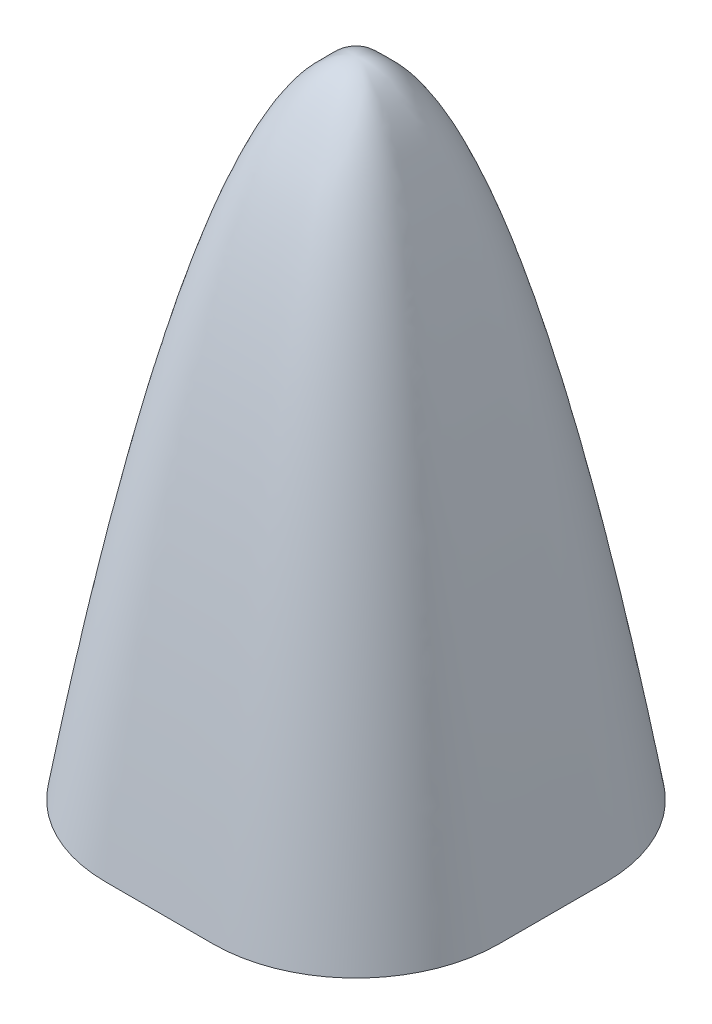
ISO-10303-21;
HEADER;
FILE_DESCRIPTION(('STEP AP214'),'2;1');
FILE_NAME('part.step','',(''),(''),'','','');
FILE_SCHEMA(('AUTOMOTIVE_DESIGN { 1 0 10303 214 1 1 1 1 }'));
ENDSEC;
DATA;
#1=APPLICATION_CONTEXT('core data for automotive mechanical design processes');
#2=APPLICATION_PROTOCOL_DEFINITION('international standard','automotive_design',2000,#1);
#3=PRODUCT_CONTEXT('',#1,'mechanical');
#4=PRODUCT('Part','Part','',(#3));
#5=PRODUCT_RELATED_PRODUCT_CATEGORY('part','',(#4));
#6=PRODUCT_DEFINITION_FORMATION('','',#4);
#7=PRODUCT_DEFINITION_CONTEXT('part definition',#1,'design');
#8=PRODUCT_DEFINITION('design','',#6,#7);
#9=PRODUCT_DEFINITION_SHAPE('','',#8);
#10=(LENGTH_UNIT() NAMED_UNIT(*) SI_UNIT(.MILLI.,.METRE.));
#11=(NAMED_UNIT(*) PLANE_ANGLE_UNIT() SI_UNIT($,.RADIAN.));
#12=(NAMED_UNIT(*) SI_UNIT($,.STERADIAN.) SOLID_ANGLE_UNIT());
#13=UNCERTAINTY_MEASURE_WITH_UNIT(LENGTH_MEASURE(1.E-05),#10,'distance_accuracy_value','');
#14=(GEOMETRIC_REPRESENTATION_CONTEXT(3) GLOBAL_UNCERTAINTY_ASSIGNED_CONTEXT((#13)) GLOBAL_UNIT_ASSIGNED_CONTEXT((#10,
#11,#12)) REPRESENTATION_CONTEXT('',''));
#15=CARTESIAN_POINT('',(0.,0.,0.));
#16=DIRECTION('',(0.,0.,1.));
#17=DIRECTION('',(1.,0.,0.));
#18=AXIS2_PLACEMENT_3D('',#15,#16,#17);
#19=CARTESIAN_POINT('',(1.5,0.,1.5));
#20=DIRECTION('',(0.,1.,0.));
#21=DIRECTION('',(0.,0.,1.));
#22=AXIS2_PLACEMENT_3D('',#19,#20,#21);
#23=PLANE('',#22);
#24=DIRECTION('',(1.,0.,0.));
#25=VECTOR('',#24,1.);
#26=CARTESIAN_POINT('',(-1.49999999999997,0.,5.5));
#27=LINE('',#26,#25);
#28=CARTESIAN_POINT('',(-1.5,0.,5.5));
#29=VERTEX_POINT('',#28);
#30=CARTESIAN_POINT('',(1.49999999999997,0.,5.5));
#31=VERTEX_POINT('',#30);
#32=EDGE_CURVE('E201',#29,#31,#27,.T.);
#33=ORIENTED_EDGE('',*,*,#32,.F.);
#34=CARTESIAN_POINT('',(-1.5,0.,1.5));
#35=DIRECTION('',(0.,1.,0.));
#36=DIRECTION('',(0.,0.,1.));
#37=AXIS2_PLACEMENT_3D('',#34,#35,#36);
#38=CIRCLE('',#37,4.);
#39=CARTESIAN_POINT('',(-5.5,0.,1.49999999999997));
#40=VERTEX_POINT('',#39);
#41=EDGE_CURVE('E13',#40,#29,#38,.T.);
#42=ORIENTED_EDGE('',*,*,#41,.F.);
#43=DIRECTION('',(0.,0.,1.));
#44=VECTOR('',#43,1.);
#45=CARTESIAN_POINT('',(-5.5,0.,-1.49999999999997));
#46=LINE('',#45,#44);
#47=CARTESIAN_POINT('',(-5.5,0.,-1.49999999999997));
#48=VERTEX_POINT('',#47);
#49=EDGE_CURVE('E166',#48,#40,#46,.T.);
#50=ORIENTED_EDGE('',*,*,#49,.F.);
#51=CARTESIAN_POINT('',(-1.5,0.,-1.5));
#52=DIRECTION('',(0.,1.,0.));
#53=DIRECTION('',(0.,0.,1.));
#54=AXIS2_PLACEMENT_3D('',#51,#52,#53);
#55=CIRCLE('',#54,4.);
#56=CARTESIAN_POINT('',(-1.49999999999997,0.,-5.5));
#57=VERTEX_POINT('',#56);
#58=EDGE_CURVE('E266',#57,#48,#55,.T.);
#59=ORIENTED_EDGE('',*,*,#58,.F.);
#60=DIRECTION('',(1.,0.,0.));
#61=VECTOR('',#60,1.);
#62=CARTESIAN_POINT('',(-1.49999999999997,0.,-5.5));
#63=LINE('',#62,#61);
#64=CARTESIAN_POINT('',(1.49999999999997,0.,-5.5));
#65=VERTEX_POINT('',#64);
#66=EDGE_CURVE('E258',#57,#65,#63,.T.);
#67=ORIENTED_EDGE('',*,*,#66,.T.);
#68=CARTESIAN_POINT('',(1.5,0.,-1.5));
#69=DIRECTION('',(0.,1.,0.));
#70=DIRECTION('',(0.,0.,1.));
#71=AXIS2_PLACEMENT_3D('',#68,#69,#70);
#72=CIRCLE('',#71,4.);
#73=CARTESIAN_POINT('',(5.5,0.,-1.49999999999997));
#74=VERTEX_POINT('',#73);
#75=EDGE_CURVE('E242',#74,#65,#72,.T.);
#76=ORIENTED_EDGE('',*,*,#75,.F.);
#77=DIRECTION('',(0.,0.,1.));
#78=VECTOR('',#77,1.);
#79=CARTESIAN_POINT('',(5.5,0.,-1.49999999999997));
#80=LINE('',#79,#78);
#81=CARTESIAN_POINT('',(5.5,0.,1.49999999999997));
#82=VERTEX_POINT('',#81);
#83=EDGE_CURVE('E203',#74,#82,#80,.T.);
#84=ORIENTED_EDGE('',*,*,#83,.T.);
#85=CARTESIAN_POINT('',(1.5,0.,1.5));
#86=DIRECTION('',(0.,1.,0.));
#87=DIRECTION('',(0.,0.,1.));
#88=AXIS2_PLACEMENT_3D('',#85,#86,#87);
#89=CIRCLE('',#88,4.);
#90=EDGE_CURVE('E202',#31,#82,#89,.T.);
#91=ORIENTED_EDGE('',*,*,#90,.F.);
#92=EDGE_LOOP('',(#33,#42,#50,#59,#67,#76,#84,#91));
#93=FACE_BOUND('',#92,.T.);
#94=ADVANCED_FACE('F152',(#93),#23,.F.);
#95=CARTESIAN_POINT('',(0.,0.,-5.5));
#96=CARTESIAN_POINT('',(0.,12.,-3.66666666666667));
#97=CARTESIAN_POINT('',(0.,18.,-1.83333333333333));
#98=CARTESIAN_POINT('',(0.,18.,0.));
#99=CARTESIAN_POINT('',(-0.124999999999998,0.,-5.5));
#100=CARTESIAN_POINT('',(-0.0833333333333317,12.,-3.66666666666667));
#101=CARTESIAN_POINT('',(-0.0416666666666659,18.,-1.83333333333333));
#102=CARTESIAN_POINT('',(0.,18.,0.));
#103=CARTESIAN_POINT('',(-0.374999999999992,0.,-5.5));
#104=CARTESIAN_POINT('',(-0.249999999999995,12.,-3.66666666666666));
#105=CARTESIAN_POINT('',(-0.124999999999997,18.,-1.83333333333333));
#106=CARTESIAN_POINT('',(0.,18.,0.));
#107=CARTESIAN_POINT('',(-0.749999999999986,0.,-5.5));
#108=CARTESIAN_POINT('',(-0.49999999999999,12.,-3.66666666666667));
#109=CARTESIAN_POINT('',(-0.249999999999995,18.,-1.83333333333333));
#110=CARTESIAN_POINT('',(0.,18.,0.));
#111=CARTESIAN_POINT('',(-1.12499999999998,0.,-5.49999999999999));
#112=CARTESIAN_POINT('',(-0.749999999999984,12.,-3.66666666666666));
#113=CARTESIAN_POINT('',(-0.374999999999992,18.,-1.83333333333333));
#114=CARTESIAN_POINT('',(0.,18.,0.));
#115=CARTESIAN_POINT('',(-1.37499999999997,0.,-5.5));
#116=CARTESIAN_POINT('',(-0.916666666666648,12.,-3.66666666666667));
#117=CARTESIAN_POINT('',(-0.458333333333324,18.,-1.83333333333333));
#118=CARTESIAN_POINT('',(0.,18.,0.));
#119=CARTESIAN_POINT('',(-2.02359877219142,0.,-5.5));
#120=CARTESIAN_POINT('',(-1.34906584812761,12.,-3.66666666666667));
#121=CARTESIAN_POINT('',(-0.674532924063806,18.,-1.83333333333333));
#122=CARTESIAN_POINT('',(0.,18.,0.));
#123=CARTESIAN_POINT('',(-3.07062167964767,0.,-5.29196002703282));
#124=CARTESIAN_POINT('',(-2.04708111976512,12.,-3.52797335135521));
#125=CARTESIAN_POINT('',(-1.02354055988256,18.,-1.76398667567761));
#126=CARTESIAN_POINT('',(0.,18.,0.));
#127=CARTESIAN_POINT('',(-4.40212765733191,0.,-4.40212765733191));
#128=CARTESIAN_POINT('',(-2.93475177155461,12.,-2.93475177155461));
#129=CARTESIAN_POINT('',(-1.4673758857773,18.,-1.4673758857773));
#130=CARTESIAN_POINT('',(0.,18.,0.));
#131=CARTESIAN_POINT('',(-5.29196002703281,0.,-3.07062167964768));
#132=CARTESIAN_POINT('',(-3.52797335135521,12.,-2.04708111976512));
#133=CARTESIAN_POINT('',(-1.7639866756776,18.,-1.02354055988256));
#134=CARTESIAN_POINT('',(0.,18.,0.));
#135=CARTESIAN_POINT('',(-5.5,0.,-2.02359877219142));
#136=CARTESIAN_POINT('',(-3.66666666666667,12.,-1.34906584812761));
#137=CARTESIAN_POINT('',(-1.83333333333333,18.,-0.674532924063806));
#138=CARTESIAN_POINT('',(0.,18.,0.));
#139=CARTESIAN_POINT('',(-5.5,0.,-1.24999999999998));
#140=CARTESIAN_POINT('',(-3.66666666666667,12.,-0.833333333333318));
#141=CARTESIAN_POINT('',(-1.83333333333333,18.,-0.416666666666659));
#142=CARTESIAN_POINT('',(0.,18.,0.));
#143=CARTESIAN_POINT('',(-5.5,0.,-0.749999999999986));
#144=CARTESIAN_POINT('',(-3.66666666666667,12.,-0.499999999999991));
#145=CARTESIAN_POINT('',(-1.83333333333333,18.,-0.249999999999996));
#146=CARTESIAN_POINT('',(0.,18.,0.));
#147=CARTESIAN_POINT('',(-5.5,0.,0.));
#148=CARTESIAN_POINT('',(-3.66666666666667,12.,0.));
#149=CARTESIAN_POINT('',(-1.83333333333333,18.,0.));
#150=CARTESIAN_POINT('',(0.,18.,0.));
#151=CARTESIAN_POINT('',(-5.5,0.,0.749999999999984));
#152=CARTESIAN_POINT('',(-3.66666666666666,12.,0.499999999999989));
#153=CARTESIAN_POINT('',(-1.83333333333333,18.,0.249999999999994));
#154=CARTESIAN_POINT('',(0.,18.,0.));
#155=CARTESIAN_POINT('',(-5.5,0.,1.24999999999997));
#156=CARTESIAN_POINT('',(-3.66666666666667,12.,0.833333333333315));
#157=CARTESIAN_POINT('',(-1.83333333333333,18.,0.416666666666658));
#158=CARTESIAN_POINT('',(0.,18.,0.));
#159=CARTESIAN_POINT('',(-5.5,0.,2.02359877219141));
#160=CARTESIAN_POINT('',(-3.66666666666667,12.,1.34906584812761));
#161=CARTESIAN_POINT('',(-1.83333333333333,18.,0.674532924063805));
#162=CARTESIAN_POINT('',(0.,18.,0.));
#163=CARTESIAN_POINT('',(-5.29196002703282,0.,3.07062167964767));
#164=CARTESIAN_POINT('',(-3.52797335135521,12.,2.04708111976511));
#165=CARTESIAN_POINT('',(-1.76398667567761,18.,1.02354055988256));
#166=CARTESIAN_POINT('',(0.,18.,0.));
#167=CARTESIAN_POINT('',(-4.40212765733193,0.,4.4021276573319));
#168=CARTESIAN_POINT('',(-2.93475177155462,12.,2.9347517715546));
#169=CARTESIAN_POINT('',(-1.46737588577731,18.,1.4673758857773));
#170=CARTESIAN_POINT('',(0.,18.,0.));
#171=CARTESIAN_POINT('',(-3.07062167964769,0.,5.29196002703281));
#172=CARTESIAN_POINT('',(-2.04708111976513,12.,3.52797335135521));
#173=CARTESIAN_POINT('',(-1.02354055988256,18.,1.7639866756776));
#174=CARTESIAN_POINT('',(0.,18.,0.));
#175=CARTESIAN_POINT('',(-2.02359877219144,0.,5.5));
#176=CARTESIAN_POINT('',(-1.34906584812763,12.,3.66666666666666));
#177=CARTESIAN_POINT('',(-0.674532924063815,18.,1.83333333333333));
#178=CARTESIAN_POINT('',(0.,18.,0.));
#179=CARTESIAN_POINT('',(-1.25,0.,5.5));
#180=CARTESIAN_POINT('',(-0.833333333333335,12.,3.66666666666667));
#181=CARTESIAN_POINT('',(-0.416666666666667,18.,1.83333333333333));
#182=CARTESIAN_POINT('',(0.,18.,0.));
#183=CARTESIAN_POINT('',(-0.750000000000007,0.,5.49999999999999));
#184=CARTESIAN_POINT('',(-0.500000000000005,12.,3.66666666666666));
#185=CARTESIAN_POINT('',(-0.250000000000002,18.,1.83333333333333));
#186=CARTESIAN_POINT('',(0.,18.,0.));
#187=CARTESIAN_POINT('',(0.,0.,5.50000000000001));
#188=CARTESIAN_POINT('',(0.,12.,3.66666666666667));
#189=CARTESIAN_POINT('',(0.,18.,1.83333333333334));
#190=CARTESIAN_POINT('',(0.,18.,0.));
#191=CARTESIAN_POINT('',(0.749999999999978,0.,5.49999999999999));
#192=CARTESIAN_POINT('',(0.499999999999985,12.,3.66666666666666));
#193=CARTESIAN_POINT('',(0.249999999999993,18.,1.83333333333333));
#194=CARTESIAN_POINT('',(0.,18.,0.));
#195=CARTESIAN_POINT('',(1.24999999999997,0.,5.5));
#196=CARTESIAN_POINT('',(0.833333333333315,12.,3.66666666666667));
#197=CARTESIAN_POINT('',(0.416666666666658,18.,1.83333333333333));
#198=CARTESIAN_POINT('',(0.,18.,0.));
#199=CARTESIAN_POINT('',(2.02359877219142,0.,5.5));
#200=CARTESIAN_POINT('',(1.34906584812761,12.,3.66666666666667));
#201=CARTESIAN_POINT('',(0.674532924063806,18.,1.83333333333333));
#202=CARTESIAN_POINT('',(0.,18.,0.));
#203=CARTESIAN_POINT('',(3.07062167964767,0.,5.29196002703281));
#204=CARTESIAN_POINT('',(2.04708111976511,12.,3.52797335135521));
#205=CARTESIAN_POINT('',(1.02354055988256,18.,1.7639866756776));
#206=CARTESIAN_POINT('',(0.,18.,0.));
#207=CARTESIAN_POINT('',(4.40212765733192,0.,4.40212765733192));
#208=CARTESIAN_POINT('',(2.93475177155461,12.,2.93475177155461));
#209=CARTESIAN_POINT('',(1.46737588577731,18.,1.4673758857773));
#210=CARTESIAN_POINT('',(0.,18.,0.));
#211=CARTESIAN_POINT('',(5.29196002703281,0.,3.07062167964768));
#212=CARTESIAN_POINT('',(3.52797335135521,12.,2.04708111976512));
#213=CARTESIAN_POINT('',(1.7639866756776,18.,1.02354055988256));
#214=CARTESIAN_POINT('',(0.,18.,0.));
#215=CARTESIAN_POINT('',(5.5,0.,2.02359877219142));
#216=CARTESIAN_POINT('',(3.66666666666667,12.,1.34906584812761));
#217=CARTESIAN_POINT('',(1.83333333333333,18.,0.674532924063805));
#218=CARTESIAN_POINT('',(0.,18.,0.));
#219=CARTESIAN_POINT('',(5.5,0.,1.24999999999998));
#220=CARTESIAN_POINT('',(3.66666666666666,12.,0.833333333333317));
#221=CARTESIAN_POINT('',(1.83333333333333,18.,0.416666666666658));
#222=CARTESIAN_POINT('',(0.,18.,0.));
#223=CARTESIAN_POINT('',(5.5,0.,0.749999999999987));
#224=CARTESIAN_POINT('',(3.66666666666667,12.,0.499999999999991));
#225=CARTESIAN_POINT('',(1.83333333333333,18.,0.249999999999995));
#226=CARTESIAN_POINT('',(0.,18.,0.));
#227=CARTESIAN_POINT('',(5.5,0.,0.));
#228=CARTESIAN_POINT('',(3.66666666666667,12.,0.));
#229=CARTESIAN_POINT('',(1.83333333333333,18.,0.));
#230=CARTESIAN_POINT('',(0.,18.,0.));
#231=CARTESIAN_POINT('',(5.49999999999999,0.,-0.749999999999984));
#232=CARTESIAN_POINT('',(3.66666666666666,12.,-0.49999999999999));
#233=CARTESIAN_POINT('',(1.83333333333333,18.,-0.249999999999995));
#234=CARTESIAN_POINT('',(0.,18.,0.));
#235=CARTESIAN_POINT('',(5.5,0.,-1.24999999999997));
#236=CARTESIAN_POINT('',(3.66666666666667,12.,-0.833333333333317));
#237=CARTESIAN_POINT('',(1.83333333333333,18.,-0.416666666666659));
#238=CARTESIAN_POINT('',(0.,18.,0.));
#239=CARTESIAN_POINT('',(5.5,0.,-2.02359877219142));
#240=CARTESIAN_POINT('',(3.66666666666667,12.,-1.34906584812761));
#241=CARTESIAN_POINT('',(1.83333333333333,18.,-0.674532924063806));
#242=CARTESIAN_POINT('',(0.,18.,0.));
#243=CARTESIAN_POINT('',(5.29196002703282,0.,-3.07062167964767));
#244=CARTESIAN_POINT('',(3.52797335135521,12.,-2.04708111976511));
#245=CARTESIAN_POINT('',(1.76398667567761,18.,-1.02354055988256));
#246=CARTESIAN_POINT('',(0.,18.,0.));
#247=CARTESIAN_POINT('',(4.40212765733192,0.,-4.40212765733192));
#248=CARTESIAN_POINT('',(2.93475177155461,12.,-2.93475177155461));
#249=CARTESIAN_POINT('',(1.46737588577731,18.,-1.46737588577731));
#250=CARTESIAN_POINT('',(0.,18.,0.));
#251=CARTESIAN_POINT('',(3.07062167964767,0.,-5.29196002703281));
#252=CARTESIAN_POINT('',(2.04708111976511,12.,-3.52797335135521));
#253=CARTESIAN_POINT('',(1.02354055988256,18.,-1.7639866756776));
#254=CARTESIAN_POINT('',(0.,18.,0.));
#255=CARTESIAN_POINT('',(2.02359877219142,0.,-5.5));
#256=CARTESIAN_POINT('',(1.34906584812761,12.,-3.66666666666667));
#257=CARTESIAN_POINT('',(0.674532924063807,18.,-1.83333333333333));
#258=CARTESIAN_POINT('',(0.,18.,0.));
#259=CARTESIAN_POINT('',(1.37499999999997,0.,-5.5));
#260=CARTESIAN_POINT('',(0.916666666666648,12.,-3.66666666666667));
#261=CARTESIAN_POINT('',(0.458333333333324,18.,-1.83333333333333));
#262=CARTESIAN_POINT('',(0.,18.,0.));
#263=CARTESIAN_POINT('',(1.12499999999998,0.,-5.5));
#264=CARTESIAN_POINT('',(0.749999999999986,12.,-3.66666666666667));
#265=CARTESIAN_POINT('',(0.374999999999993,18.,-1.83333333333333));
#266=CARTESIAN_POINT('',(0.,18.,0.));
#267=CARTESIAN_POINT('',(0.749999999999985,0.,-5.49999999999999));
#268=CARTESIAN_POINT('',(0.49999999999999,12.,-3.66666666666666));
#269=CARTESIAN_POINT('',(0.249999999999995,18.,-1.83333333333333));
#270=CARTESIAN_POINT('',(0.,18.,0.));
#271=CARTESIAN_POINT('',(0.374999999999994,0.,-5.5));
#272=CARTESIAN_POINT('',(0.249999999999996,12.,-3.66666666666667));
#273=CARTESIAN_POINT('',(0.124999999999998,18.,-1.83333333333333));
#274=CARTESIAN_POINT('',(0.,18.,0.));
#275=CARTESIAN_POINT('',(0.124999999999998,0.,-5.5));
#276=CARTESIAN_POINT('',(0.0833333333333319,12.,-3.66666666666666));
#277=CARTESIAN_POINT('',(0.0416666666666659,18.,-1.83333333333333));
#278=CARTESIAN_POINT('',(0.,18.,0.));
#279=CARTESIAN_POINT('',(0.,0.,-5.5));
#280=CARTESIAN_POINT('',(0.,12.,-3.66666666666667));
#281=CARTESIAN_POINT('',(0.,18.,-1.83333333333333));
#282=CARTESIAN_POINT('',(0.,18.,0.));
#283=B_SPLINE_SURFACE_WITH_KNOTS('',3,3,((#95,#96,#97,#98),(#99,#100,#101,#102),(#103,#104,#105,
#106),(#107,#108,#109,#110),(#111,#112,#113,#114),(#115,#116,#117,#118),(#119,#120,#121,#122),
(#123,#124,#125,#126),(#127,#128,#129,#130),(#131,#132,#133,#134),(#135,#136,#137,#138),(#139,
#140,#141,#142),(#143,#144,#145,#146),(#147,#148,#149,#150),(#151,#152,#153,#154),(#155,#156,
#157,#158),(#159,#160,#161,#162),(#163,#164,#165,#166),(#167,#168,#169,#170),(#171,#172,#173,
#174),(#175,#176,#177,#178),(#179,#180,#181,#182),(#183,#184,#185,#186),(#187,#188,#189,#190),
(#191,#192,#193,#194),(#195,#196,#197,#198),(#199,#200,#201,#202),(#203,#204,#205,#206),(#207,
#208,#209,#210),(#211,#212,#213,#214),(#215,#216,#217,#218),(#219,#220,#221,#222),(#223,#224,
#225,#226),(#227,#228,#229,#230),(#231,#232,#233,#234),(#235,#236,#237,#238),(#239,#240,#241,
#242),(#243,#244,#245,#246),(#247,#248,#249,#250),(#251,#252,#253,#254),(#255,#256,#257,#258),
(#259,#260,#261,#262),(#263,#264,#265,#266),(#267,#268,#269,#270),(#271,#272,#273,#274),(#275,
#276,#277,#278),(#279,#280,#281,#282)),.UNSPECIFIED.,.T.,.F.,.F.,(4,1,1,1,2,1,1,1,2,1,1,1,2,1,1,
1,2,1,1,1,2,1,1,1,2,1,1,1,2,1,1,1,2,1,1,1,4),(4,4),(0.,0.0100989042982361,0.0201978085964722,
0.0302967128947083,0.0403956171929444,0.0826978085964722,0.125,0.167302191403528,
0.209604382807056,0.229802191403528,0.25,0.270197808596472,0.290395617192944,0.332697808596472,
0.375,0.417302191403527,0.459604382807055,0.479802191403527,0.5,0.520197808596472,
0.540395617192944,0.582697808596472,0.625,0.667302191403528,0.709604382807056,0.729802191403528,
0.75,0.770197808596472,0.790395617192944,0.832697808596472,0.875,0.917302191403528,
0.959604382807056,0.969703287105292,0.979802191403528,0.989901095701764,1.),(0.,1.),.UNSPECIFIED.);
#284=CARTESIAN_POINT('',(0.,0.,5.5));
#285=CARTESIAN_POINT('',(0.,12.,3.66666666666667));
#286=CARTESIAN_POINT('',(0.,18.,1.83333333333333));
#287=CARTESIAN_POINT('',(0.,18.,0.));
#288=CARTESIAN_POINT('',(0.249999999999983,0.,5.5));
#289=CARTESIAN_POINT('',(0.166666666666656,12.,3.66666666666667));
#290=CARTESIAN_POINT('',(0.0833333333333278,18.,1.83333333333333));
#291=CARTESIAN_POINT('',(0.,18.,0.));
#292=CARTESIAN_POINT('',(0.749999999999978,0.,5.49999999999999));
#293=CARTESIAN_POINT('',(0.499999999999985,12.,3.66666666666666));
#294=CARTESIAN_POINT('',(0.249999999999993,18.,1.83333333333333));
#295=CARTESIAN_POINT('',(0.,18.,0.));
#296=CARTESIAN_POINT('',(1.24999999999997,0.,5.5));
#297=CARTESIAN_POINT('',(0.833333333333315,12.,3.66666666666667));
#298=CARTESIAN_POINT('',(0.416666666666658,18.,1.83333333333333));
#299=CARTESIAN_POINT('',(0.,18.,0.));
#300=CARTESIAN_POINT('',(2.02359877219142,0.,5.5));
#301=CARTESIAN_POINT('',(1.34906584812761,12.,3.66666666666667));
#302=CARTESIAN_POINT('',(0.674532924063806,18.,1.83333333333333));
#303=CARTESIAN_POINT('',(0.,18.,0.));
#304=CARTESIAN_POINT('',(3.07062167964767,0.,5.29196002703281));
#305=CARTESIAN_POINT('',(2.04708111976511,12.,3.52797335135521));
#306=CARTESIAN_POINT('',(1.02354055988256,18.,1.7639866756776));
#307=CARTESIAN_POINT('',(0.,18.,0.));
#308=CARTESIAN_POINT('',(4.40212765733192,0.,4.40212765733192));
#309=CARTESIAN_POINT('',(2.93475177155461,12.,2.93475177155461));
#310=CARTESIAN_POINT('',(1.46737588577731,18.,1.4673758857773));
#311=CARTESIAN_POINT('',(0.,18.,0.));
#312=CARTESIAN_POINT('',(5.29196002703281,0.,3.07062167964768));
#313=CARTESIAN_POINT('',(3.52797335135521,12.,2.04708111976512));
#314=CARTESIAN_POINT('',(1.7639866756776,18.,1.02354055988256));
#315=CARTESIAN_POINT('',(0.,18.,0.));
#316=CARTESIAN_POINT('',(5.5,0.,2.02359877219142));
#317=CARTESIAN_POINT('',(3.66666666666667,12.,1.34906584812761));
#318=CARTESIAN_POINT('',(1.83333333333333,18.,0.674532924063805));
#319=CARTESIAN_POINT('',(0.,18.,0.));
#320=CARTESIAN_POINT('',(5.5,0.,1.24999999999998));
#321=CARTESIAN_POINT('',(3.66666666666666,12.,0.833333333333317));
#322=CARTESIAN_POINT('',(1.83333333333333,18.,0.416666666666658));
#323=CARTESIAN_POINT('',(0.,18.,0.));
#324=CARTESIAN_POINT('',(5.5,0.,0.749999999999987));
#325=CARTESIAN_POINT('',(3.66666666666667,12.,0.499999999999991));
#326=CARTESIAN_POINT('',(1.83333333333333,18.,0.249999999999995));
#327=CARTESIAN_POINT('',(0.,18.,0.));
#328=CARTESIAN_POINT('',(5.5,0.,0.));
#329=CARTESIAN_POINT('',(3.66666666666667,12.,0.));
#330=CARTESIAN_POINT('',(1.83333333333333,18.,0.));
#331=CARTESIAN_POINT('',(0.,18.,0.));
#332=CARTESIAN_POINT('',(5.49999999999999,0.,-0.749999999999984));
#333=CARTESIAN_POINT('',(3.66666666666666,12.,-0.49999999999999));
#334=CARTESIAN_POINT('',(1.83333333333333,18.,-0.249999999999995));
#335=CARTESIAN_POINT('',(0.,18.,0.));
#336=CARTESIAN_POINT('',(5.5,0.,-1.24999999999997));
#337=CARTESIAN_POINT('',(3.66666666666667,12.,-0.833333333333317));
#338=CARTESIAN_POINT('',(1.83333333333333,18.,-0.416666666666659));
#339=CARTESIAN_POINT('',(0.,18.,0.));
#340=CARTESIAN_POINT('',(5.5,0.,-2.02359877219142));
#341=CARTESIAN_POINT('',(3.66666666666667,12.,-1.34906584812761));
#342=CARTESIAN_POINT('',(1.83333333333333,18.,-0.674532924063806));
#343=CARTESIAN_POINT('',(0.,18.,0.));
#344=CARTESIAN_POINT('',(5.29196002703282,0.,-3.07062167964767));
#345=CARTESIAN_POINT('',(3.52797335135521,12.,-2.04708111976511));
#346=CARTESIAN_POINT('',(1.76398667567761,18.,-1.02354055988256));
#347=CARTESIAN_POINT('',(0.,18.,0.));
#348=CARTESIAN_POINT('',(4.40212765733192,0.,-4.40212765733192));
#349=CARTESIAN_POINT('',(2.93475177155461,12.,-2.93475177155461));
#350=CARTESIAN_POINT('',(1.46737588577731,18.,-1.46737588577731));
#351=CARTESIAN_POINT('',(0.,18.,0.));
#352=CARTESIAN_POINT('',(3.07062167964767,0.,-5.29196002703281));
#353=CARTESIAN_POINT('',(2.04708111976511,12.,-3.52797335135521));
#354=CARTESIAN_POINT('',(1.02354055988256,18.,-1.7639866756776));
#355=CARTESIAN_POINT('',(0.,18.,0.));
#356=CARTESIAN_POINT('',(2.02359877219142,0.,-5.5));
#357=CARTESIAN_POINT('',(1.34906584812761,12.,-3.66666666666667));
#358=CARTESIAN_POINT('',(0.674532924063807,18.,-1.83333333333333));
#359=CARTESIAN_POINT('',(0.,18.,0.));
#360=CARTESIAN_POINT('',(1.37499999999997,0.,-5.5));
#361=CARTESIAN_POINT('',(0.916666666666648,12.,-3.66666666666667));
#362=CARTESIAN_POINT('',(0.458333333333324,18.,-1.83333333333333));
#363=CARTESIAN_POINT('',(0.,18.,0.));
#364=CARTESIAN_POINT('',(1.12499999999998,0.,-5.5));
#365=CARTESIAN_POINT('',(0.749999999999986,12.,-3.66666666666667));
#366=CARTESIAN_POINT('',(0.374999999999993,18.,-1.83333333333333));
#367=CARTESIAN_POINT('',(0.,18.,0.));
#368=CARTESIAN_POINT('',(0.749999999999985,0.,-5.49999999999999));
#369=CARTESIAN_POINT('',(0.49999999999999,12.,-3.66666666666666));
#370=CARTESIAN_POINT('',(0.249999999999995,18.,-1.83333333333333));
#371=CARTESIAN_POINT('',(0.,18.,0.));
#372=CARTESIAN_POINT('',(0.374999999999994,0.,-5.5));
#373=CARTESIAN_POINT('',(0.249999999999996,12.,-3.66666666666667));
#374=CARTESIAN_POINT('',(0.124999999999998,18.,-1.83333333333333));
#375=CARTESIAN_POINT('',(0.,18.,0.));
#376=CARTESIAN_POINT('',(0.124999999999998,0.,-5.5));
#377=CARTESIAN_POINT('',(0.0833333333333319,12.,-3.66666666666666));
#378=CARTESIAN_POINT('',(0.0416666666666659,18.,-1.83333333333333));
#379=CARTESIAN_POINT('',(0.,18.,0.));
#380=CARTESIAN_POINT('',(0.,0.,-5.5));
#381=CARTESIAN_POINT('',(0.,12.,-3.66666666666667));
#382=CARTESIAN_POINT('',(0.,18.,-1.83333333333333));
#383=CARTESIAN_POINT('',(0.,18.,0.));
#384=CARTESIAN_POINT('',(-0.124999999999998,0.,-5.5));
#385=CARTESIAN_POINT('',(-0.0833333333333317,12.,-3.66666666666667));
#386=CARTESIAN_POINT('',(-0.0416666666666659,18.,-1.83333333333333));
#387=CARTESIAN_POINT('',(0.,18.,0.));
#388=CARTESIAN_POINT('',(-0.374999999999992,0.,-5.5));
#389=CARTESIAN_POINT('',(-0.249999999999995,12.,-3.66666666666666));
#390=CARTESIAN_POINT('',(-0.124999999999997,18.,-1.83333333333333));
#391=CARTESIAN_POINT('',(0.,18.,0.));
#392=CARTESIAN_POINT('',(-0.749999999999986,0.,-5.5));
#393=CARTESIAN_POINT('',(-0.49999999999999,12.,-3.66666666666667));
#394=CARTESIAN_POINT('',(-0.249999999999995,18.,-1.83333333333333));
#395=CARTESIAN_POINT('',(0.,18.,0.));
#396=CARTESIAN_POINT('',(-1.12499999999998,0.,-5.49999999999999));
#397=CARTESIAN_POINT('',(-0.749999999999984,12.,-3.66666666666666));
#398=CARTESIAN_POINT('',(-0.374999999999992,18.,-1.83333333333333));
#399=CARTESIAN_POINT('',(0.,18.,0.));
#400=CARTESIAN_POINT('',(-1.37499999999997,0.,-5.5));
#401=CARTESIAN_POINT('',(-0.916666666666648,12.,-3.66666666666667));
#402=CARTESIAN_POINT('',(-0.458333333333324,18.,-1.83333333333333));
#403=CARTESIAN_POINT('',(0.,18.,0.));
#404=CARTESIAN_POINT('',(-2.02359877219142,0.,-5.5));
#405=CARTESIAN_POINT('',(-1.34906584812761,12.,-3.66666666666667));
#406=CARTESIAN_POINT('',(-0.674532924063806,18.,-1.83333333333333));
#407=CARTESIAN_POINT('',(0.,18.,0.));
#408=CARTESIAN_POINT('',(-3.07062167964767,0.,-5.29196002703282));
#409=CARTESIAN_POINT('',(-2.04708111976512,12.,-3.52797335135521));
#410=CARTESIAN_POINT('',(-1.02354055988256,18.,-1.76398667567761));
#411=CARTESIAN_POINT('',(0.,18.,0.));
#412=CARTESIAN_POINT('',(-4.40212765733191,0.,-4.40212765733191));
#413=CARTESIAN_POINT('',(-2.93475177155461,12.,-2.93475177155461));
#414=CARTESIAN_POINT('',(-1.4673758857773,18.,-1.4673758857773));
#415=CARTESIAN_POINT('',(0.,18.,0.));
#416=CARTESIAN_POINT('',(-5.29196002703281,0.,-3.07062167964768));
#417=CARTESIAN_POINT('',(-3.52797335135521,12.,-2.04708111976512));
#418=CARTESIAN_POINT('',(-1.7639866756776,18.,-1.02354055988256));
#419=CARTESIAN_POINT('',(0.,18.,0.));
#420=CARTESIAN_POINT('',(-5.5,0.,-2.02359877219142));
#421=CARTESIAN_POINT('',(-3.66666666666667,12.,-1.34906584812761));
#422=CARTESIAN_POINT('',(-1.83333333333333,18.,-0.674532924063806));
#423=CARTESIAN_POINT('',(0.,18.,0.));
#424=CARTESIAN_POINT('',(-5.5,0.,-1.24999999999998));
#425=CARTESIAN_POINT('',(-3.66666666666667,12.,-0.833333333333318));
#426=CARTESIAN_POINT('',(-1.83333333333333,18.,-0.416666666666659));
#427=CARTESIAN_POINT('',(0.,18.,0.));
#428=CARTESIAN_POINT('',(-5.5,0.,-0.749999999999986));
#429=CARTESIAN_POINT('',(-3.66666666666667,12.,-0.499999999999991));
#430=CARTESIAN_POINT('',(-1.83333333333333,18.,-0.249999999999996));
#431=CARTESIAN_POINT('',(0.,18.,0.));
#432=CARTESIAN_POINT('',(-5.5,0.,0.));
#433=CARTESIAN_POINT('',(-3.66666666666667,12.,0.));
#434=CARTESIAN_POINT('',(-1.83333333333333,18.,0.));
#435=CARTESIAN_POINT('',(0.,18.,0.));
#436=CARTESIAN_POINT('',(-5.5,0.,0.749999999999984));
#437=CARTESIAN_POINT('',(-3.66666666666666,12.,0.499999999999989));
#438=CARTESIAN_POINT('',(-1.83333333333333,18.,0.249999999999994));
#439=CARTESIAN_POINT('',(0.,18.,0.));
#440=CARTESIAN_POINT('',(-5.5,0.,1.24999999999997));
#441=CARTESIAN_POINT('',(-3.66666666666667,12.,0.833333333333315));
#442=CARTESIAN_POINT('',(-1.83333333333333,18.,0.416666666666658));
#443=CARTESIAN_POINT('',(0.,18.,0.));
#444=CARTESIAN_POINT('',(-5.5,0.,2.02359877219141));
#445=CARTESIAN_POINT('',(-3.66666666666667,12.,1.34906584812761));
#446=CARTESIAN_POINT('',(-1.83333333333333,18.,0.674532924063805));
#447=CARTESIAN_POINT('',(0.,18.,0.));
#448=CARTESIAN_POINT('',(-5.29196002703282,0.,3.07062167964767));
#449=CARTESIAN_POINT('',(-3.52797335135521,12.,2.04708111976511));
#450=CARTESIAN_POINT('',(-1.76398667567761,18.,1.02354055988256));
#451=CARTESIAN_POINT('',(0.,18.,0.));
#452=CARTESIAN_POINT('',(-4.40212765733193,0.,4.4021276573319));
#453=CARTESIAN_POINT('',(-2.93475177155462,12.,2.9347517715546));
#454=CARTESIAN_POINT('',(-1.46737588577731,18.,1.4673758857773));
#455=CARTESIAN_POINT('',(0.,18.,0.));
#456=CARTESIAN_POINT('',(-3.07062167964769,0.,5.29196002703281));
#457=CARTESIAN_POINT('',(-2.04708111976513,12.,3.52797335135521));
#458=CARTESIAN_POINT('',(-1.02354055988256,18.,1.7639866756776));
#459=CARTESIAN_POINT('',(0.,18.,0.));
#460=CARTESIAN_POINT('',(-2.02359877219144,0.,5.5));
#461=CARTESIAN_POINT('',(-1.34906584812763,12.,3.66666666666666));
#462=CARTESIAN_POINT('',(-0.674532924063815,18.,1.83333333333333));
#463=CARTESIAN_POINT('',(0.,18.,0.));
#464=CARTESIAN_POINT('',(-1.25,0.,5.5));
#465=CARTESIAN_POINT('',(-0.833333333333335,12.,3.66666666666667));
#466=CARTESIAN_POINT('',(-0.416666666666667,18.,1.83333333333333));
#467=CARTESIAN_POINT('',(0.,18.,0.));
#468=CARTESIAN_POINT('',(-0.750000000000007,0.,5.49999999999999));
#469=CARTESIAN_POINT('',(-0.500000000000005,12.,3.66666666666666));
#470=CARTESIAN_POINT('',(-0.250000000000002,18.,1.83333333333333));
#471=CARTESIAN_POINT('',(0.,18.,0.));
#472=CARTESIAN_POINT('',(-0.250000000000013,0.,5.5));
#473=CARTESIAN_POINT('',(-0.166666666666675,12.,3.66666666666667));
#474=CARTESIAN_POINT('',(-0.0833333333333376,18.,1.83333333333333));
#475=CARTESIAN_POINT('',(0.,18.,0.));
#476=CARTESIAN_POINT('',(0.,0.,5.5));
#477=CARTESIAN_POINT('',(0.,12.,3.66666666666667));
#478=CARTESIAN_POINT('',(0.,18.,1.83333333333333));
#479=CARTESIAN_POINT('',(0.,18.,0.));
#480=B_SPLINE_SURFACE_WITH_KNOTS('',3,3,((#284,#285,#286,#287),(#288,#289,#290,#291),(#292,#293,
#294,#295),(#296,#297,#298,#299),(#300,#301,#302,#303),(#304,#305,#306,#307),(#308,#309,#310,
#311),(#312,#313,#314,#315),(#316,#317,#318,#319),(#320,#321,#322,#323),(#324,#325,#326,#327),
(#328,#329,#330,#331),(#332,#333,#334,#335),(#336,#337,#338,#339),(#340,#341,#342,#343),(#344,
#345,#346,#347),(#348,#349,#350,#351),(#352,#353,#354,#355),(#356,#357,#358,#359),(#360,#361,
#362,#363),(#364,#365,#366,#367),(#368,#369,#370,#371),(#372,#373,#374,#375),(#376,#377,#378,
#379),(#380,#381,#382,#383),(#384,#385,#386,#387),(#388,#389,#390,#391),(#392,#393,#394,#395),
(#396,#397,#398,#399),(#400,#401,#402,#403),(#404,#405,#406,#407),(#408,#409,#410,#411),(#412,
#413,#414,#415),(#416,#417,#418,#419),(#420,#421,#422,#423),(#424,#425,#426,#427),(#428,#429,
#430,#431),(#432,#433,#434,#435),(#436,#437,#438,#439),(#440,#441,#442,#443),(#444,#445,#446,
#447),(#448,#449,#450,#451),(#452,#453,#454,#455),(#456,#457,#458,#459),(#460,#461,#462,#463),
(#464,#465,#466,#467),(#468,#469,#470,#471),(#472,#473,#474,#475),(#476,#477,#478,#479)),
.UNSPECIFIED.,.T.,.F.,.F.,(4,1,2,1,1,1,2,1,1,1,2,1,1,1,2,1,1,1,3,1,1,1,2,1,1,1,2,1,1,1,2,1,1,1,
2,1,4),(4,4),(0.5,0.520197808596472,0.540395617192944,0.582697808596472,0.625,0.667302191403528,
0.709604382807056,0.729802191403528,0.75,0.770197808596472,0.790395617192944,0.832697808596472,
0.875,0.917302191403528,0.959604382807056,0.969703287105292,0.979802191403528,0.989901095701764,
1.,1.01009890429824,1.02019780859647,1.03029671289471,1.04039561719294,1.08269780859647,1.125,
1.16730219140353,1.20960438280706,1.22980219140353,1.25,1.27019780859647,1.29039561719294,
1.33269780859647,1.375,1.41730219140353,1.45960438280705,1.47980219140353,1.5),(0.,1.),.UNSPECIFIED.);
#481=CARTESIAN_POINT('',(0.,18.,0.));
#482=VERTEX_POINT('',#481);
#483=VERTEX_LOOP('',#482);
#484=FACE_BOUND('',#483,.T.);
#485=ORIENTED_EDGE('',*,*,#41,.T.);
#486=ORIENTED_EDGE('',*,*,#32,.T.);
#487=ORIENTED_EDGE('',*,*,#90,.T.);
#488=ORIENTED_EDGE('',*,*,#83,.F.);
#489=ORIENTED_EDGE('',*,*,#75,.T.);
#490=ORIENTED_EDGE('',*,*,#66,.F.);
#491=ORIENTED_EDGE('',*,*,#58,.T.);
#492=ORIENTED_EDGE('',*,*,#49,.T.);
#493=EDGE_LOOP('',(#485,#486,#487,#488,#489,#490,#491,#492));
#494=FACE_BOUND('',#493,.T.);
#495=ADVANCED_FACE('F160',(#484,#494),#480,.T.);
#496=CLOSED_SHELL('',(#94,#495));
#497=MANIFOLD_SOLID_BREP('B2',#496);
#498=ADVANCED_BREP_SHAPE_REPRESENTATION('',(#18,#497),#14);
#499=SHAPE_DEFINITION_REPRESENTATION(#9,#498);
ENDSEC;
END-ISO-10303-21;
